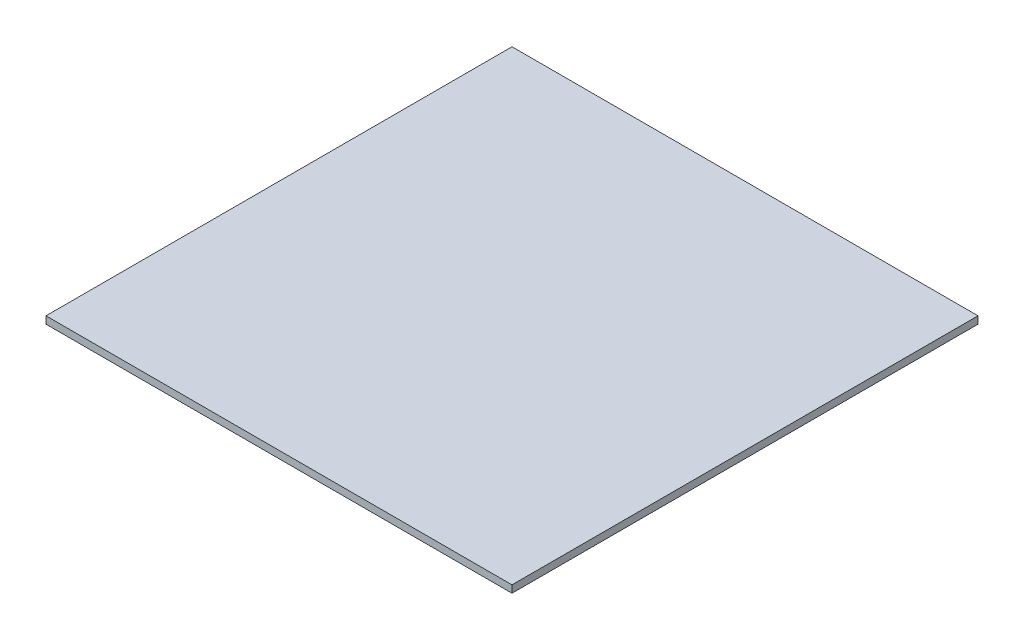
ISO-10303-21;
HEADER;
FILE_DESCRIPTION(('STEP AP214'),'2;1');
FILE_NAME('part.step','',(''),(''),'','','');
FILE_SCHEMA(('AUTOMOTIVE_DESIGN { 1 0 10303 214 1 1 1 1 }'));
ENDSEC;
DATA;
#1=APPLICATION_CONTEXT('core data for automotive mechanical design processes');
#2=APPLICATION_PROTOCOL_DEFINITION('international standard','automotive_design',2000,#1);
#3=PRODUCT_CONTEXT('',#1,'mechanical');
#4=PRODUCT('Part','Part','',(#3));
#5=PRODUCT_RELATED_PRODUCT_CATEGORY('part','',(#4));
#6=PRODUCT_DEFINITION_FORMATION('','',#4);
#7=PRODUCT_DEFINITION_CONTEXT('part definition',#1,'design');
#8=PRODUCT_DEFINITION('design','',#6,#7);
#9=PRODUCT_DEFINITION_SHAPE('','',#8);
#10=(LENGTH_UNIT() NAMED_UNIT(*) SI_UNIT(.MILLI.,.METRE.));
#11=(NAMED_UNIT(*) PLANE_ANGLE_UNIT() SI_UNIT($,.RADIAN.));
#12=(NAMED_UNIT(*) SI_UNIT($,.STERADIAN.) SOLID_ANGLE_UNIT());
#13=UNCERTAINTY_MEASURE_WITH_UNIT(LENGTH_MEASURE(1.E-05),#10,'distance_accuracy_value','');
#14=(GEOMETRIC_REPRESENTATION_CONTEXT(3) GLOBAL_UNCERTAINTY_ASSIGNED_CONTEXT((#13)) GLOBAL_UNIT_ASSIGNED_CONTEXT((#10,
#11,#12)) REPRESENTATION_CONTEXT('',''));
#15=CARTESIAN_POINT('',(0.,0.,0.));
#16=DIRECTION('',(0.,0.,1.));
#17=DIRECTION('',(1.,0.,0.));
#18=AXIS2_PLACEMENT_3D('',#15,#16,#17);
#19=CARTESIAN_POINT('',(0.,3.175,0.));
#20=DIRECTION('',(0.,0.,-1.));
#21=DIRECTION('',(-1.,0.,0.));
#22=AXIS2_PLACEMENT_3D('',#19,#20,#21);
#23=PLANE('',#22);
#24=DIRECTION('',(1.,0.,0.));
#25=VECTOR('',#24,1.);
#26=CARTESIAN_POINT('',(0.,0.,0.));
#27=LINE('',#26,#25);
#28=CARTESIAN_POINT('',(0.,0.,0.));
#29=VERTEX_POINT('',#28);
#30=CARTESIAN_POINT('',(203.2,0.,0.));
#31=VERTEX_POINT('',#30);
#32=EDGE_CURVE('E100',#29,#31,#27,.T.);
#33=ORIENTED_EDGE('',*,*,#32,.T.);
#34=DIRECTION('',(0.,-1.,0.));
#35=VECTOR('',#34,1.);
#36=CARTESIAN_POINT('',(203.2,3.175,0.));
#37=LINE('',#36,#35);
#38=CARTESIAN_POINT('',(203.2,3.175,0.));
#39=VERTEX_POINT('',#38);
#40=EDGE_CURVE('E11',#39,#31,#37,.T.);
#41=ORIENTED_EDGE('',*,*,#40,.F.);
#42=DIRECTION('',(1.,0.,0.));
#43=VECTOR('',#42,1.);
#44=CARTESIAN_POINT('',(0.,3.175,0.));
#45=LINE('',#44,#43);
#46=CARTESIAN_POINT('',(0.,3.175,0.));
#47=VERTEX_POINT('',#46);
#48=EDGE_CURVE('E86',#47,#39,#45,.T.);
#49=ORIENTED_EDGE('',*,*,#48,.F.);
#50=DIRECTION('',(0.,-1.,0.));
#51=VECTOR('',#50,1.);
#52=CARTESIAN_POINT('',(0.,3.175,0.));
#53=LINE('',#52,#51);
#54=EDGE_CURVE('E53',#47,#29,#53,.T.);
#55=ORIENTED_EDGE('',*,*,#54,.T.);
#56=EDGE_LOOP('',(#33,#41,#49,#55));
#57=FACE_BOUND('',#56,.T.);
#58=ADVANCED_FACE('F37',(#57),#23,.F.);
#59=CARTESIAN_POINT('',(203.2,3.175,0.));
#60=DIRECTION('',(-1.,0.,0.));
#61=DIRECTION('',(0.,0.,1.));
#62=AXIS2_PLACEMENT_3D('',#59,#60,#61);
#63=PLANE('',#62);
#64=DIRECTION('',(0.,0.,-1.));
#65=VECTOR('',#64,1.);
#66=CARTESIAN_POINT('',(203.2,0.,0.));
#67=LINE('',#66,#65);
#68=CARTESIAN_POINT('',(203.2,0.,-203.2));
#69=VERTEX_POINT('',#68);
#70=EDGE_CURVE('E91',#31,#69,#67,.T.);
#71=ORIENTED_EDGE('',*,*,#70,.T.);
#72=DIRECTION('',(0.,-1.,0.));
#73=VECTOR('',#72,1.);
#74=CARTESIAN_POINT('',(203.2,3.175,-203.2));
#75=LINE('',#74,#73);
#76=CARTESIAN_POINT('',(203.2,3.175,-203.2));
#77=VERTEX_POINT('',#76);
#78=EDGE_CURVE('E45',#77,#69,#75,.T.);
#79=ORIENTED_EDGE('',*,*,#78,.F.);
#80=DIRECTION('',(0.,0.,-1.));
#81=VECTOR('',#80,1.);
#82=CARTESIAN_POINT('',(203.2,3.175,0.));
#83=LINE('',#82,#81);
#84=EDGE_CURVE('E78',#39,#77,#83,.T.);
#85=ORIENTED_EDGE('',*,*,#84,.F.);
#86=ORIENTED_EDGE('',*,*,#40,.T.);
#87=EDGE_LOOP('',(#71,#79,#85,#86));
#88=FACE_BOUND('',#87,.T.);
#89=ADVANCED_FACE('F90',(#88),#63,.F.);
#90=CARTESIAN_POINT('',(0.,3.175,-203.2));
#91=DIRECTION('',(0.,0.,-1.));
#92=DIRECTION('',(-1.,0.,0.));
#93=AXIS2_PLACEMENT_3D('',#90,#91,#92);
#94=PLANE('',#93);
#95=DIRECTION('',(1.,0.,0.));
#96=VECTOR('',#95,1.);
#97=CARTESIAN_POINT('',(0.,0.,-203.2));
#98=LINE('',#97,#96);
#99=CARTESIAN_POINT('',(0.,0.,-203.2));
#100=VERTEX_POINT('',#99);
#101=EDGE_CURVE('E103',#100,#69,#98,.T.);
#102=ORIENTED_EDGE('',*,*,#101,.F.);
#103=DIRECTION('',(0.,-1.,0.));
#104=VECTOR('',#103,1.);
#105=CARTESIAN_POINT('',(0.,3.175,-203.2));
#106=LINE('',#105,#104);
#107=CARTESIAN_POINT('',(0.,3.175,-203.2));
#108=VERTEX_POINT('',#107);
#109=EDGE_CURVE('E67',#108,#100,#106,.T.);
#110=ORIENTED_EDGE('',*,*,#109,.F.);
#111=DIRECTION('',(1.,0.,0.));
#112=VECTOR('',#111,1.);
#113=CARTESIAN_POINT('',(0.,3.175,-203.2));
#114=LINE('',#113,#112);
#115=EDGE_CURVE('E85',#108,#77,#114,.T.);
#116=ORIENTED_EDGE('',*,*,#115,.T.);
#117=ORIENTED_EDGE('',*,*,#78,.T.);
#118=EDGE_LOOP('',(#102,#110,#116,#117));
#119=FACE_BOUND('',#118,.T.);
#120=ADVANCED_FACE('F94',(#119),#94,.T.);
#121=CARTESIAN_POINT('',(0.,3.175,0.));
#122=DIRECTION('',(-1.,0.,0.));
#123=DIRECTION('',(0.,0.,1.));
#124=AXIS2_PLACEMENT_3D('',#121,#122,#123);
#125=PLANE('',#124);
#126=DIRECTION('',(0.,0.,-1.));
#127=VECTOR('',#126,1.);
#128=CARTESIAN_POINT('',(0.,0.,0.));
#129=LINE('',#128,#127);
#130=EDGE_CURVE('E105',#29,#100,#129,.T.);
#131=ORIENTED_EDGE('',*,*,#130,.F.);
#132=ORIENTED_EDGE('',*,*,#54,.F.);
#133=DIRECTION('',(0.,0.,-1.));
#134=VECTOR('',#133,1.);
#135=CARTESIAN_POINT('',(0.,3.175,0.));
#136=LINE('',#135,#134);
#137=EDGE_CURVE('E95',#47,#108,#136,.T.);
#138=ORIENTED_EDGE('',*,*,#137,.T.);
#139=ORIENTED_EDGE('',*,*,#109,.T.);
#140=EDGE_LOOP('',(#131,#132,#138,#139));
#141=FACE_BOUND('',#140,.T.);
#142=ADVANCED_FACE('F111',(#141),#125,.T.);
#143=CARTESIAN_POINT('',(0.,3.175,0.));
#144=DIRECTION('',(0.,1.,0.));
#145=DIRECTION('',(0.,0.,1.));
#146=AXIS2_PLACEMENT_3D('',#143,#144,#145);
#147=PLANE('',#146);
#148=ORIENTED_EDGE('',*,*,#48,.T.);
#149=ORIENTED_EDGE('',*,*,#84,.T.);
#150=ORIENTED_EDGE('',*,*,#115,.F.);
#151=ORIENTED_EDGE('',*,*,#137,.F.);
#152=EDGE_LOOP('',(#148,#149,#150,#151));
#153=FACE_BOUND('',#152,.T.);
#154=ADVANCED_FACE('F82',(#153),#147,.T.);
#155=CARTESIAN_POINT('',(0.,0.,0.));
#156=DIRECTION('',(0.,1.,0.));
#157=DIRECTION('',(0.,0.,1.));
#158=AXIS2_PLACEMENT_3D('',#155,#156,#157);
#159=PLANE('',#158);
#160=ORIENTED_EDGE('',*,*,#32,.F.);
#161=ORIENTED_EDGE('',*,*,#130,.T.);
#162=ORIENTED_EDGE('',*,*,#101,.T.);
#163=ORIENTED_EDGE('',*,*,#70,.F.);
#164=EDGE_LOOP('',(#160,#161,#162,#163));
#165=FACE_BOUND('',#164,.T.);
#166=ADVANCED_FACE('F110',(#165),#159,.F.);
#167=CLOSED_SHELL('',(#58,#89,#120,#142,#154,#166));
#168=MANIFOLD_SOLID_BREP('B2',#167);
#169=ADVANCED_BREP_SHAPE_REPRESENTATION('',(#18,#168),#14);
#170=SHAPE_DEFINITION_REPRESENTATION(#9,#169);
ENDSEC;
END-ISO-10303-21;
